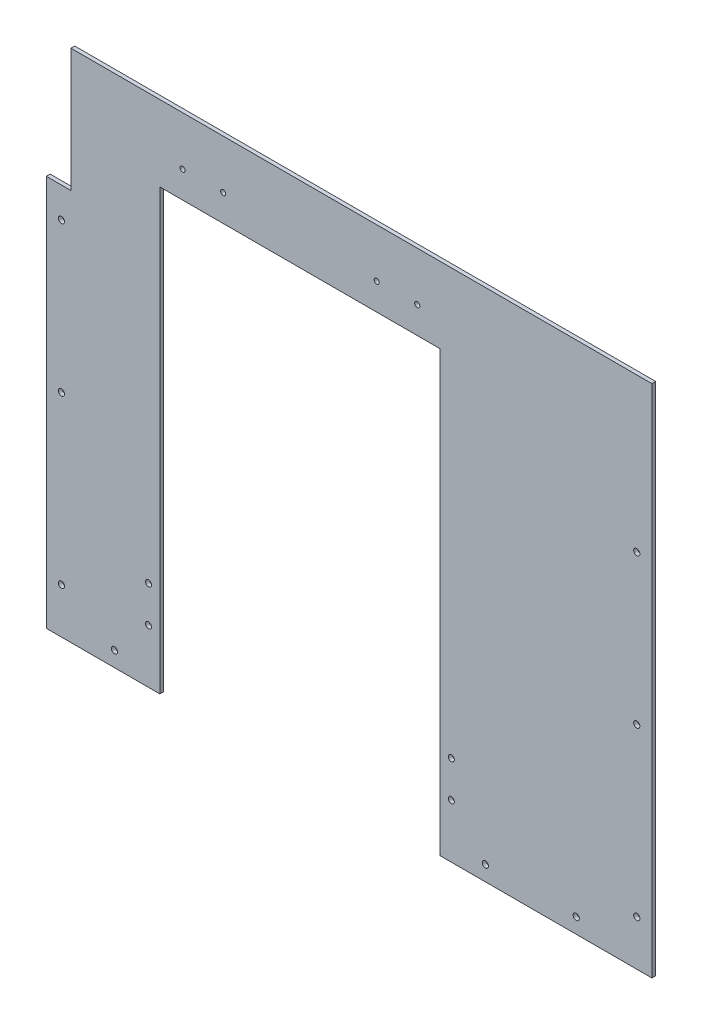
ISO-10303-21;
HEADER;
FILE_DESCRIPTION(('STEP AP214'),'2;1');
FILE_NAME('part.step','',(''),(''),'','','');
FILE_SCHEMA(('AUTOMOTIVE_DESIGN { 1 0 10303 214 1 1 1 1 }'));
ENDSEC;
DATA;
#1=APPLICATION_CONTEXT('core data for automotive mechanical design processes');
#2=APPLICATION_PROTOCOL_DEFINITION('international standard','automotive_design',2000,#1);
#3=PRODUCT_CONTEXT('',#1,'mechanical');
#4=PRODUCT('Part','Part','',(#3));
#5=PRODUCT_RELATED_PRODUCT_CATEGORY('part','',(#4));
#6=PRODUCT_DEFINITION_FORMATION('','',#4);
#7=PRODUCT_DEFINITION_CONTEXT('part definition',#1,'design');
#8=PRODUCT_DEFINITION('design','',#6,#7);
#9=PRODUCT_DEFINITION_SHAPE('','',#8);
#10=(LENGTH_UNIT() NAMED_UNIT(*) SI_UNIT(.MILLI.,.METRE.));
#11=(NAMED_UNIT(*) PLANE_ANGLE_UNIT() SI_UNIT($,.RADIAN.));
#12=(NAMED_UNIT(*) SI_UNIT($,.STERADIAN.) SOLID_ANGLE_UNIT());
#13=UNCERTAINTY_MEASURE_WITH_UNIT(LENGTH_MEASURE(1.E-05),#10,'distance_accuracy_value','');
#14=(GEOMETRIC_REPRESENTATION_CONTEXT(3) GLOBAL_UNCERTAINTY_ASSIGNED_CONTEXT((#13)) GLOBAL_UNIT_ASSIGNED_CONTEXT((#10,
#11,#12)) REPRESENTATION_CONTEXT('',''));
#15=CARTESIAN_POINT('',(0.,0.,0.));
#16=DIRECTION('',(0.,0.,1.));
#17=DIRECTION('',(1.,0.,0.));
#18=AXIS2_PLACEMENT_3D('',#15,#16,#17);
#19=CARTESIAN_POINT('',(0.,0.,3.175));
#20=DIRECTION('',(0.,1.,0.));
#21=DIRECTION('',(0.,0.,1.));
#22=AXIS2_PLACEMENT_3D('',#19,#20,#21);
#23=PLANE('',#22);
#24=DIRECTION('',(1.,0.,0.));
#25=VECTOR('',#24,1.);
#26=CARTESIAN_POINT('',(0.,0.,0.));
#27=LINE('',#26,#25);
#28=CARTESIAN_POINT('',(0.,0.,0.));
#29=VERTEX_POINT('',#28);
#30=CARTESIAN_POINT('',(95.2500000000001,-1.02649894704531E-13,0.));
#31=VERTEX_POINT('',#30);
#32=EDGE_CURVE('E147',#29,#31,#27,.T.);
#33=ORIENTED_EDGE('',*,*,#32,.T.);
#34=DIRECTION('',(0.,0.,-1.));
#35=VECTOR('',#34,1.);
#36=CARTESIAN_POINT('',(95.2500000000001,-1.02649894704531E-13,44.45));
#37=LINE('',#36,#35);
#38=CARTESIAN_POINT('',(95.2500000000001,-1.02649894704531E-13,3.175));
#39=VERTEX_POINT('',#38);
#40=EDGE_CURVE('E234',#39,#31,#37,.T.);
#41=ORIENTED_EDGE('',*,*,#40,.F.);
#42=DIRECTION('',(1.,0.,0.));
#43=VECTOR('',#42,1.);
#44=CARTESIAN_POINT('',(0.,0.,3.175));
#45=LINE('',#44,#43);
#46=CARTESIAN_POINT('',(0.,0.,3.175));
#47=VERTEX_POINT('',#46);
#48=EDGE_CURVE('E160',#47,#39,#45,.T.);
#49=ORIENTED_EDGE('',*,*,#48,.F.);
#50=DIRECTION('',(0.,0.,-1.));
#51=VECTOR('',#50,1.);
#52=CARTESIAN_POINT('',(0.,0.,3.175));
#53=LINE('',#52,#51);
#54=EDGE_CURVE('E11',#47,#29,#53,.T.);
#55=ORIENTED_EDGE('',*,*,#54,.T.);
#56=EDGE_LOOP('',(#33,#41,#49,#55));
#57=FACE_BOUND('',#56,.T.);
#58=ADVANCED_FACE('F42',(#57),#23,.F.);
#59=CARTESIAN_POINT('',(0.,0.,3.175));
#60=DIRECTION('',(1.,0.,0.));
#61=DIRECTION('',(0.,0.,-1.));
#62=AXIS2_PLACEMENT_3D('',#59,#60,#61);
#63=PLANE('',#62);
#64=DIRECTION('',(0.,-1.,0.));
#65=VECTOR('',#64,1.);
#66=CARTESIAN_POINT('',(0.,0.,3.175));
#67=LINE('',#66,#65);
#68=CARTESIAN_POINT('',(0.,328.45375,3.175));
#69=VERTEX_POINT('',#68);
#70=EDGE_CURVE('E146',#69,#47,#67,.T.);
#71=ORIENTED_EDGE('',*,*,#70,.F.);
#72=DIRECTION('',(0.,0.,-1.));
#73=VECTOR('',#72,1.);
#74=CARTESIAN_POINT('',(0.,328.45375,44.45));
#75=LINE('',#74,#73);
#76=CARTESIAN_POINT('',(0.,328.45375,0.));
#77=VERTEX_POINT('',#76);
#78=EDGE_CURVE('E219',#69,#77,#75,.T.);
#79=ORIENTED_EDGE('',*,*,#78,.T.);
#80=DIRECTION('',(0.,-1.,0.));
#81=VECTOR('',#80,1.);
#82=CARTESIAN_POINT('',(0.,0.,0.));
#83=LINE('',#82,#81);
#84=EDGE_CURVE('E166',#77,#29,#83,.T.);
#85=ORIENTED_EDGE('',*,*,#84,.T.);
#86=ORIENTED_EDGE('',*,*,#54,.F.);
#87=EDGE_LOOP('',(#71,#79,#85,#86));
#88=FACE_BOUND('',#87,.T.);
#89=ADVANCED_FACE('F44',(#88),#63,.F.);
#90=CARTESIAN_POINT('',(330.2,-1.60196047796465E-13,3.175));
#91=VERTEX_POINT('',#90);
#92=CARTESIAN_POINT('',(508.,0.,3.175));
#93=VERTEX_POINT('',#92);
#94=EDGE_CURVE('E151',#91,#93,#45,.T.);
#95=ORIENTED_EDGE('',*,*,#94,.F.);
#96=DIRECTION('',(0.,0.,-1.));
#97=VECTOR('',#96,1.);
#98=CARTESIAN_POINT('',(330.2,-1.60196047796465E-13,44.45));
#99=LINE('',#98,#97);
#100=CARTESIAN_POINT('',(330.2,-1.60196047796465E-13,0.));
#101=VERTEX_POINT('',#100);
#102=EDGE_CURVE('E230',#91,#101,#99,.T.);
#103=ORIENTED_EDGE('',*,*,#102,.T.);
#104=CARTESIAN_POINT('',(508.,0.,0.));
#105=VERTEX_POINT('',#104);
#106=EDGE_CURVE('E154',#101,#105,#27,.T.);
#107=ORIENTED_EDGE('',*,*,#106,.T.);
#108=DIRECTION('',(0.,0.,-1.));
#109=VECTOR('',#108,1.);
#110=CARTESIAN_POINT('',(508.,0.,3.175));
#111=LINE('',#110,#109);
#112=EDGE_CURVE('E51',#93,#105,#111,.T.);
#113=ORIENTED_EDGE('',*,*,#112,.F.);
#114=EDGE_LOOP('',(#95,#103,#107,#113));
#115=FACE_BOUND('',#114,.T.);
#116=ADVANCED_FACE('F381',(#115),#23,.F.);
#117=CARTESIAN_POINT('',(508.,0.,3.175));
#118=DIRECTION('',(-1.,0.,0.));
#119=DIRECTION('',(0.,0.,1.));
#120=AXIS2_PLACEMENT_3D('',#117,#118,#119);
#121=PLANE('',#120);
#122=DIRECTION('',(0.,1.,0.));
#123=VECTOR('',#122,1.);
#124=CARTESIAN_POINT('',(508.,0.,0.));
#125=LINE('',#124,#123);
#126=CARTESIAN_POINT('',(508.,431.8,0.));
#127=VERTEX_POINT('',#126);
#128=EDGE_CURVE('E137',#105,#127,#125,.T.);
#129=ORIENTED_EDGE('',*,*,#128,.T.);
#130=DIRECTION('',(0.,0.,1.));
#131=VECTOR('',#130,1.);
#132=CARTESIAN_POINT('',(508.,431.8,0.));
#133=LINE('',#132,#131);
#134=CARTESIAN_POINT('',(508.,431.8,3.175));
#135=VERTEX_POINT('',#134);
#136=EDGE_CURVE('E119',#127,#135,#133,.T.);
#137=ORIENTED_EDGE('',*,*,#136,.T.);
#138=DIRECTION('',(0.,1.,0.));
#139=VECTOR('',#138,1.);
#140=CARTESIAN_POINT('',(508.,0.,3.175));
#141=LINE('',#140,#139);
#142=EDGE_CURVE('E158',#93,#135,#141,.T.);
#143=ORIENTED_EDGE('',*,*,#142,.F.);
#144=ORIENTED_EDGE('',*,*,#112,.T.);
#145=EDGE_LOOP('',(#129,#137,#143,#144));
#146=FACE_BOUND('',#145,.T.);
#147=ADVANCED_FACE('F143',(#146),#121,.F.);
#148=CARTESIAN_POINT('',(0.,0.,3.175));
#149=DIRECTION('',(0.,0.,-1.));
#150=DIRECTION('',(-1.,0.,0.));
#151=AXIS2_PLACEMENT_3D('',#148,#149,#150);
#152=PLANE('',#151);
#153=CARTESIAN_POINT('',(368.3,12.7,3.175));
#154=DIRECTION('',(0.,0.,1.));
#155=DIRECTION('',(1.,0.,0.));
#156=AXIS2_PLACEMENT_3D('',#153,#154,#155);
#157=CIRCLE('',#156,2.60000000000002);
#158=CARTESIAN_POINT('',(370.9,12.7,3.175));
#159=VERTEX_POINT('',#158);
#160=EDGE_CURVE('E337',#159,#159,#157,.T.);
#161=ORIENTED_EDGE('',*,*,#160,.F.);
#162=EDGE_LOOP('',(#161));
#163=FACE_BOUND('',#162,.T.);
#164=CARTESIAN_POINT('',(57.15,12.6999999999999,3.175));
#165=DIRECTION('',(0.,0.,1.));
#166=DIRECTION('',(1.,0.,0.));
#167=AXIS2_PLACEMENT_3D('',#164,#165,#166);
#168=CIRCLE('',#167,2.6);
#169=CARTESIAN_POINT('',(59.75,12.6999999999999,3.175));
#170=VERTEX_POINT('',#169);
#171=EDGE_CURVE('E346',#170,#170,#168,.T.);
#172=ORIENTED_EDGE('',*,*,#171,.F.);
#173=EDGE_LOOP('',(#172));
#174=FACE_BOUND('',#173,.T.);
#175=CARTESIAN_POINT('',(495.3,303.05375,3.175));
#176=DIRECTION('',(0.,0.,1.));
#177=DIRECTION('',(1.,0.,0.));
#178=AXIS2_PLACEMENT_3D('',#175,#176,#177);
#179=CIRCLE('',#178,2.60000000000001);
#180=CARTESIAN_POINT('',(497.9,303.05375,3.175));
#181=VERTEX_POINT('',#180);
#182=EDGE_CURVE('E306',#181,#181,#179,.T.);
#183=ORIENTED_EDGE('',*,*,#182,.F.);
#184=EDGE_LOOP('',(#183));
#185=FACE_BOUND('',#184,.T.);
#186=CARTESIAN_POINT('',(495.3,177.8,3.175));
#187=DIRECTION('',(0.,0.,1.));
#188=DIRECTION('',(1.,0.,0.));
#189=AXIS2_PLACEMENT_3D('',#186,#187,#188);
#190=CIRCLE('',#189,2.60000000000001);
#191=CARTESIAN_POINT('',(497.9,177.8,3.175));
#192=VERTEX_POINT('',#191);
#193=EDGE_CURVE('E305',#192,#192,#190,.T.);
#194=ORIENTED_EDGE('',*,*,#193,.F.);
#195=EDGE_LOOP('',(#194));
#196=FACE_BOUND('',#195,.T.);
#197=CARTESIAN_POINT('',(495.3,38.0999999999999,3.175));
#198=DIRECTION('',(0.,0.,1.));
#199=DIRECTION('',(1.,0.,0.));
#200=AXIS2_PLACEMENT_3D('',#197,#198,#199);
#201=CIRCLE('',#200,2.60000000000002);
#202=CARTESIAN_POINT('',(497.9,38.0999999999999,3.175));
#203=VERTEX_POINT('',#202);
#204=EDGE_CURVE('E314',#203,#203,#201,.T.);
#205=ORIENTED_EDGE('',*,*,#204,.F.);
#206=EDGE_LOOP('',(#205));
#207=FACE_BOUND('',#206,.T.);
#208=CARTESIAN_POINT('',(12.7,38.1,3.175));
#209=DIRECTION('',(0.,0.,1.));
#210=DIRECTION('',(1.,0.,0.));
#211=AXIS2_PLACEMENT_3D('',#208,#209,#210);
#212=CIRCLE('',#211,2.59999999999999);
#213=CARTESIAN_POINT('',(15.3,38.1,3.175));
#214=VERTEX_POINT('',#213);
#215=EDGE_CURVE('E322',#214,#214,#212,.T.);
#216=ORIENTED_EDGE('',*,*,#215,.F.);
#217=EDGE_LOOP('',(#216));
#218=FACE_BOUND('',#217,.T.);
#219=CARTESIAN_POINT('',(12.7,177.8,3.175));
#220=DIRECTION('',(0.,0.,1.));
#221=DIRECTION('',(1.,0.,0.));
#222=AXIS2_PLACEMENT_3D('',#219,#220,#221);
#223=CIRCLE('',#222,2.59999999999999);
#224=CARTESIAN_POINT('',(15.3,177.8,3.175));
#225=VERTEX_POINT('',#224);
#226=EDGE_CURVE('E297',#225,#225,#223,.T.);
#227=ORIENTED_EDGE('',*,*,#226,.F.);
#228=EDGE_LOOP('',(#227));
#229=FACE_BOUND('',#228,.T.);
#230=CARTESIAN_POINT('',(444.5,12.7,3.175));
#231=DIRECTION('',(0.,0.,1.));
#232=DIRECTION('',(1.,0.,0.));
#233=AXIS2_PLACEMENT_3D('',#230,#231,#232);
#234=CIRCLE('',#233,2.60000000000002);
#235=CARTESIAN_POINT('',(447.1,12.7,3.175));
#236=VERTEX_POINT('',#235);
#237=EDGE_CURVE('E338',#236,#236,#234,.T.);
#238=ORIENTED_EDGE('',*,*,#237,.F.);
#239=EDGE_LOOP('',(#238));
#240=FACE_BOUND('',#239,.T.);
#241=CARTESIAN_POINT('',(12.7,303.05375,3.175));
#242=DIRECTION('',(0.,0.,1.));
#243=DIRECTION('',(1.,0.,0.));
#244=AXIS2_PLACEMENT_3D('',#241,#242,#243);
#245=CIRCLE('',#244,2.6);
#246=CARTESIAN_POINT('',(15.2999999999999,303.05375,3.175));
#247=VERTEX_POINT('',#246);
#248=EDGE_CURVE('E293',#247,#247,#245,.T.);
#249=ORIENTED_EDGE('',*,*,#248,.F.);
#250=EDGE_LOOP('',(#249));
#251=FACE_BOUND('',#250,.T.);
#252=CARTESIAN_POINT('',(311.1754,390.779,3.175));
#253=DIRECTION('',(0.,0.,-1.));
#254=DIRECTION('',(-1.,0.,0.));
#255=AXIS2_PLACEMENT_3D('',#252,#253,#254);
#256=CIRCLE('',#255,2.15900000000003);
#257=CARTESIAN_POINT('',(309.0164,390.779,3.175));
#258=VERTEX_POINT('',#257);
#259=EDGE_CURVE('E260',#258,#258,#256,.T.);
#260=ORIENTED_EDGE('',*,*,#259,.T.);
#261=EDGE_LOOP('',(#260));
#262=FACE_BOUND('',#261,.T.);
#263=CARTESIAN_POINT('',(277.1394,390.779,3.175));
#264=DIRECTION('',(0.,0.,-1.));
#265=DIRECTION('',(-1.,0.,0.));
#266=AXIS2_PLACEMENT_3D('',#263,#264,#265);
#267=CIRCLE('',#266,2.15900000000003);
#268=CARTESIAN_POINT('',(274.9804,390.779,3.175));
#269=VERTEX_POINT('',#268);
#270=EDGE_CURVE('E278',#269,#269,#267,.T.);
#271=ORIENTED_EDGE('',*,*,#270,.T.);
#272=EDGE_LOOP('',(#271));
#273=FACE_BOUND('',#272,.T.);
#274=CARTESIAN_POINT('',(148.3614,390.779,3.175));
#275=DIRECTION('',(0.,0.,-1.));
#276=DIRECTION('',(-1.,0.,0.));
#277=AXIS2_PLACEMENT_3D('',#274,#275,#276);
#278=CIRCLE('',#277,2.159);
#279=CARTESIAN_POINT('',(146.2024,390.779,3.175));
#280=VERTEX_POINT('',#279);
#281=EDGE_CURVE('E270',#280,#280,#278,.T.);
#282=ORIENTED_EDGE('',*,*,#281,.T.);
#283=EDGE_LOOP('',(#282));
#284=FACE_BOUND('',#283,.T.);
#285=CARTESIAN_POINT('',(114.3254,390.779,3.175));
#286=DIRECTION('',(0.,0.,-1.));
#287=DIRECTION('',(-1.,0.,0.));
#288=AXIS2_PLACEMENT_3D('',#285,#286,#287);
#289=CIRCLE('',#288,2.159);
#290=CARTESIAN_POINT('',(112.1664,390.779,3.175));
#291=VERTEX_POINT('',#290);
#292=EDGE_CURVE('E261',#291,#291,#289,.T.);
#293=ORIENTED_EDGE('',*,*,#292,.T.);
#294=EDGE_LOOP('',(#293));
#295=FACE_BOUND('',#294,.T.);
#296=ORIENTED_EDGE('',*,*,#142,.T.);
#297=DIRECTION('',(1.,0.,0.));
#298=VECTOR('',#297,1.);
#299=CARTESIAN_POINT('',(20.6374999999999,431.8,3.175));
#300=LINE('',#299,#298);
#301=CARTESIAN_POINT('',(20.6374999999999,431.8,3.175));
#302=VERTEX_POINT('',#301);
#303=EDGE_CURVE('E122',#302,#135,#300,.T.);
#304=ORIENTED_EDGE('',*,*,#303,.F.);
#305=DIRECTION('',(0.,-1.,0.));
#306=VECTOR('',#305,1.);
#307=CARTESIAN_POINT('',(20.6375,0.,3.175));
#308=LINE('',#307,#306);
#309=CARTESIAN_POINT('',(20.6374999999999,328.45375,3.175));
#310=VERTEX_POINT('',#309);
#311=EDGE_CURVE('E191',#302,#310,#308,.T.);
#312=ORIENTED_EDGE('',*,*,#311,.T.);
#313=DIRECTION('',(-1.,0.,0.));
#314=VECTOR('',#313,1.);
#315=CARTESIAN_POINT('',(0.,328.45375,3.175));
#316=LINE('',#315,#314);
#317=EDGE_CURVE('E187',#310,#69,#316,.T.);
#318=ORIENTED_EDGE('',*,*,#317,.T.);
#319=ORIENTED_EDGE('',*,*,#70,.T.);
#320=ORIENTED_EDGE('',*,*,#48,.T.);
#321=DIRECTION('',(0.,1.,0.));
#322=VECTOR('',#321,1.);
#323=CARTESIAN_POINT('',(95.2500000000001,0.,3.175));
#324=LINE('',#323,#322);
#325=CARTESIAN_POINT('',(95.2500000000001,368.3,3.175));
#326=VERTEX_POINT('',#325);
#327=EDGE_CURVE('E168',#39,#326,#324,.T.);
#328=ORIENTED_EDGE('',*,*,#327,.T.);
#329=DIRECTION('',(1.,0.,0.));
#330=VECTOR('',#329,1.);
#331=CARTESIAN_POINT('',(0.,368.3,3.175));
#332=LINE('',#331,#330);
#333=CARTESIAN_POINT('',(330.2,368.3,3.175));
#334=VERTEX_POINT('',#333);
#335=EDGE_CURVE('E182',#326,#334,#332,.T.);
#336=ORIENTED_EDGE('',*,*,#335,.T.);
#337=DIRECTION('',(0.,-1.,0.));
#338=VECTOR('',#337,1.);
#339=CARTESIAN_POINT('',(330.2,0.,3.175));
#340=LINE('',#339,#338);
#341=EDGE_CURVE('E177',#334,#91,#340,.T.);
#342=ORIENTED_EDGE('',*,*,#341,.T.);
#343=ORIENTED_EDGE('',*,*,#94,.T.);
#344=EDGE_LOOP('',(#296,#304,#312,#318,#319,#320,#328,#336,#342,#343));
#345=FACE_BOUND('',#344,.T.);
#346=CARTESIAN_POINT('',(339.725,75.565,3.175));
#347=DIRECTION('',(0.,0.,-1.));
#348=DIRECTION('',(-1.,0.,0.));
#349=AXIS2_PLACEMENT_3D('',#346,#347,#348);
#350=CIRCLE('',#349,2.54000000000001);
#351=CARTESIAN_POINT('',(337.185,75.565,3.175));
#352=VERTEX_POINT('',#351);
#353=EDGE_CURVE('E194',#352,#352,#350,.T.);
#354=ORIENTED_EDGE('',*,*,#353,.T.);
#355=EDGE_LOOP('',(#354));
#356=FACE_BOUND('',#355,.T.);
#357=CARTESIAN_POINT('',(85.7250000000001,45.085,3.175));
#358=DIRECTION('',(0.,0.,-1.));
#359=DIRECTION('',(-1.,0.,0.));
#360=AXIS2_PLACEMENT_3D('',#357,#358,#359);
#361=CIRCLE('',#360,2.53999999999998);
#362=CARTESIAN_POINT('',(83.1850000000001,45.085,3.175));
#363=VERTEX_POINT('',#362);
#364=EDGE_CURVE('E198',#363,#363,#361,.T.);
#365=ORIENTED_EDGE('',*,*,#364,.T.);
#366=EDGE_LOOP('',(#365));
#367=FACE_BOUND('',#366,.T.);
#368=CARTESIAN_POINT('',(85.725,75.565,3.175));
#369=DIRECTION('',(0.,0.,-1.));
#370=DIRECTION('',(-1.,0.,0.));
#371=AXIS2_PLACEMENT_3D('',#368,#369,#370);
#372=CIRCLE('',#371,2.54000000000001);
#373=CARTESIAN_POINT('',(83.185,75.565,3.175));
#374=VERTEX_POINT('',#373);
#375=EDGE_CURVE('E202',#374,#374,#372,.T.);
#376=ORIENTED_EDGE('',*,*,#375,.T.);
#377=EDGE_LOOP('',(#376));
#378=FACE_BOUND('',#377,.T.);
#379=CARTESIAN_POINT('',(339.725,45.085,3.175));
#380=DIRECTION('',(0.,0.,-1.));
#381=DIRECTION('',(-1.,0.,0.));
#382=AXIS2_PLACEMENT_3D('',#379,#380,#381);
#383=CIRCLE('',#382,2.54000000000001);
#384=CARTESIAN_POINT('',(337.185,45.085,3.175));
#385=VERTEX_POINT('',#384);
#386=EDGE_CURVE('E206',#385,#385,#383,.T.);
#387=ORIENTED_EDGE('',*,*,#386,.T.);
#388=EDGE_LOOP('',(#387));
#389=FACE_BOUND('',#388,.T.);
#390=ADVANCED_FACE('F368',(#163,#174,#185,#196,#207,#218,#229,#240,#251,#262,#273,#284,#295,
#345,#356,#367,#378,#389),#152,.F.);
#391=CARTESIAN_POINT('',(0.,0.,0.));
#392=DIRECTION('',(0.,0.,-1.));
#393=DIRECTION('',(-1.,0.,0.));
#394=AXIS2_PLACEMENT_3D('',#391,#392,#393);
#395=PLANE('',#394);
#396=DIRECTION('',(1.,0.,0.));
#397=VECTOR('',#396,1.);
#398=CARTESIAN_POINT('',(20.6374999999999,431.8,0.));
#399=LINE('',#398,#397);
#400=CARTESIAN_POINT('',(20.6374999999999,431.8,0.));
#401=VERTEX_POINT('',#400);
#402=EDGE_CURVE('E58',#401,#127,#399,.T.);
#403=ORIENTED_EDGE('',*,*,#402,.T.);
#404=ORIENTED_EDGE('',*,*,#128,.F.);
#405=ORIENTED_EDGE('',*,*,#106,.F.);
#406=DIRECTION('',(0.,-1.,0.));
#407=VECTOR('',#406,1.);
#408=CARTESIAN_POINT('',(330.2,-1.60196047796465E-13,0.));
#409=LINE('',#408,#407);
#410=CARTESIAN_POINT('',(330.2,368.3,0.));
#411=VERTEX_POINT('',#410);
#412=EDGE_CURVE('E227',#411,#101,#409,.T.);
#413=ORIENTED_EDGE('',*,*,#412,.F.);
#414=DIRECTION('',(1.,0.,0.));
#415=VECTOR('',#414,1.);
#416=CARTESIAN_POINT('',(95.2500000000001,368.3,0.));
#417=LINE('',#416,#415);
#418=CARTESIAN_POINT('',(95.2500000000001,368.3,0.));
#419=VERTEX_POINT('',#418);
#420=EDGE_CURVE('E239',#419,#411,#417,.T.);
#421=ORIENTED_EDGE('',*,*,#420,.F.);
#422=DIRECTION('',(0.,1.,0.));
#423=VECTOR('',#422,1.);
#424=CARTESIAN_POINT('',(95.2500000000001,-1.02649894704531E-13,0.));
#425=LINE('',#424,#423);
#426=EDGE_CURVE('E66',#31,#419,#425,.T.);
#427=ORIENTED_EDGE('',*,*,#426,.F.);
#428=ORIENTED_EDGE('',*,*,#32,.F.);
#429=ORIENTED_EDGE('',*,*,#84,.F.);
#430=DIRECTION('',(-1.,0.,0.));
#431=VECTOR('',#430,1.);
#432=CARTESIAN_POINT('',(0.,328.45375,0.));
#433=LINE('',#432,#431);
#434=CARTESIAN_POINT('',(20.6374999999999,328.45375,0.));
#435=VERTEX_POINT('',#434);
#436=EDGE_CURVE('E250',#435,#77,#433,.T.);
#437=ORIENTED_EDGE('',*,*,#436,.F.);
#438=DIRECTION('',(0.,-1.,0.));
#439=VECTOR('',#438,1.);
#440=CARTESIAN_POINT('',(20.6374999999999,403.06625,0.));
#441=LINE('',#440,#439);
#442=EDGE_CURVE('E139',#401,#435,#441,.T.);
#443=ORIENTED_EDGE('',*,*,#442,.F.);
#444=EDGE_LOOP('',(#403,#404,#405,#413,#421,#427,#428,#429,#437,#443));
#445=FACE_BOUND('',#444,.T.);
#446=CARTESIAN_POINT('',(368.3,12.7,0.));
#447=DIRECTION('',(0.,0.,1.));
#448=DIRECTION('',(1.,0.,0.));
#449=AXIS2_PLACEMENT_3D('',#446,#447,#448);
#450=CIRCLE('',#449,2.60000000000002);
#451=CARTESIAN_POINT('',(370.9,12.7,0.));
#452=VERTEX_POINT('',#451);
#453=EDGE_CURVE('E333',#452,#452,#450,.T.);
#454=ORIENTED_EDGE('',*,*,#453,.T.);
#455=EDGE_LOOP('',(#454));
#456=FACE_BOUND('',#455,.T.);
#457=CARTESIAN_POINT('',(57.15,12.6999999999999,0.));
#458=DIRECTION('',(0.,0.,1.));
#459=DIRECTION('',(1.,0.,0.));
#460=AXIS2_PLACEMENT_3D('',#457,#458,#459);
#461=CIRCLE('',#460,2.6);
#462=CARTESIAN_POINT('',(59.75,12.6999999999999,0.));
#463=VERTEX_POINT('',#462);
#464=EDGE_CURVE('E342',#463,#463,#461,.T.);
#465=ORIENTED_EDGE('',*,*,#464,.T.);
#466=EDGE_LOOP('',(#465));
#467=FACE_BOUND('',#466,.T.);
#468=CARTESIAN_POINT('',(495.3,303.05375,0.));
#469=DIRECTION('',(0.,0.,1.));
#470=DIRECTION('',(1.,0.,0.));
#471=AXIS2_PLACEMENT_3D('',#468,#469,#470);
#472=CIRCLE('',#471,2.60000000000001);
#473=CARTESIAN_POINT('',(497.9,303.05375,0.));
#474=VERTEX_POINT('',#473);
#475=EDGE_CURVE('E350',#474,#474,#472,.T.);
#476=ORIENTED_EDGE('',*,*,#475,.T.);
#477=EDGE_LOOP('',(#476));
#478=FACE_BOUND('',#477,.T.);
#479=CARTESIAN_POINT('',(495.3,177.8,0.));
#480=DIRECTION('',(0.,0.,1.));
#481=DIRECTION('',(1.,0.,0.));
#482=AXIS2_PLACEMENT_3D('',#479,#480,#481);
#483=CIRCLE('',#482,2.60000000000001);
#484=CARTESIAN_POINT('',(497.9,177.8,0.));
#485=VERTEX_POINT('',#484);
#486=EDGE_CURVE('E301',#485,#485,#483,.T.);
#487=ORIENTED_EDGE('',*,*,#486,.T.);
#488=EDGE_LOOP('',(#487));
#489=FACE_BOUND('',#488,.T.);
#490=CARTESIAN_POINT('',(495.3,38.0999999999999,0.));
#491=DIRECTION('',(0.,0.,1.));
#492=DIRECTION('',(1.,0.,0.));
#493=AXIS2_PLACEMENT_3D('',#490,#491,#492);
#494=CIRCLE('',#493,2.60000000000002);
#495=CARTESIAN_POINT('',(497.9,38.0999999999999,0.));
#496=VERTEX_POINT('',#495);
#497=EDGE_CURVE('E310',#496,#496,#494,.T.);
#498=ORIENTED_EDGE('',*,*,#497,.T.);
#499=EDGE_LOOP('',(#498));
#500=FACE_BOUND('',#499,.T.);
#501=CARTESIAN_POINT('',(12.7,38.1,0.));
#502=DIRECTION('',(0.,0.,1.));
#503=DIRECTION('',(1.,0.,0.));
#504=AXIS2_PLACEMENT_3D('',#501,#502,#503);
#505=CIRCLE('',#504,2.59999999999999);
#506=CARTESIAN_POINT('',(15.3,38.1,0.));
#507=VERTEX_POINT('',#506);
#508=EDGE_CURVE('E318',#507,#507,#505,.T.);
#509=ORIENTED_EDGE('',*,*,#508,.T.);
#510=EDGE_LOOP('',(#509));
#511=FACE_BOUND('',#510,.T.);
#512=CARTESIAN_POINT('',(12.7,177.8,0.));
#513=DIRECTION('',(0.,0.,1.));
#514=DIRECTION('',(1.,0.,0.));
#515=AXIS2_PLACEMENT_3D('',#512,#513,#514);
#516=CIRCLE('',#515,2.59999999999999);
#517=CARTESIAN_POINT('',(15.3,177.8,0.));
#518=VERTEX_POINT('',#517);
#519=EDGE_CURVE('E326',#518,#518,#516,.T.);
#520=ORIENTED_EDGE('',*,*,#519,.T.);
#521=EDGE_LOOP('',(#520));
#522=FACE_BOUND('',#521,.T.);
#523=CARTESIAN_POINT('',(444.5,12.7,0.));
#524=DIRECTION('',(0.,0.,1.));
#525=DIRECTION('',(1.,0.,0.));
#526=AXIS2_PLACEMENT_3D('',#523,#524,#525);
#527=CIRCLE('',#526,2.60000000000002);
#528=CARTESIAN_POINT('',(447.1,12.7,0.));
#529=VERTEX_POINT('',#528);
#530=EDGE_CURVE('E128',#529,#529,#527,.T.);
#531=ORIENTED_EDGE('',*,*,#530,.T.);
#532=EDGE_LOOP('',(#531));
#533=FACE_BOUND('',#532,.T.);
#534=CARTESIAN_POINT('',(12.7,303.05375,0.));
#535=DIRECTION('',(0.,0.,1.));
#536=DIRECTION('',(1.,0.,0.));
#537=AXIS2_PLACEMENT_3D('',#534,#535,#536);
#538=CIRCLE('',#537,2.6);
#539=CARTESIAN_POINT('',(15.2999999999999,303.05375,0.));
#540=VERTEX_POINT('',#539);
#541=EDGE_CURVE('E266',#540,#540,#538,.T.);
#542=ORIENTED_EDGE('',*,*,#541,.T.);
#543=EDGE_LOOP('',(#542));
#544=FACE_BOUND('',#543,.T.);
#545=CARTESIAN_POINT('',(311.1754,390.779,0.));
#546=DIRECTION('',(0.,0.,-1.));
#547=DIRECTION('',(-1.,0.,0.));
#548=AXIS2_PLACEMENT_3D('',#545,#546,#547);
#549=CIRCLE('',#548,2.15900000000003);
#550=CARTESIAN_POINT('',(309.0164,390.779,0.));
#551=VERTEX_POINT('',#550);
#552=EDGE_CURVE('E286',#551,#551,#549,.T.);
#553=ORIENTED_EDGE('',*,*,#552,.F.);
#554=EDGE_LOOP('',(#553));
#555=FACE_BOUND('',#554,.T.);
#556=CARTESIAN_POINT('',(277.1394,390.779,0.));
#557=DIRECTION('',(0.,0.,-1.));
#558=DIRECTION('',(-1.,0.,0.));
#559=AXIS2_PLACEMENT_3D('',#556,#557,#558);
#560=CIRCLE('',#559,2.15900000000003);
#561=CARTESIAN_POINT('',(274.9804,390.779,0.));
#562=VERTEX_POINT('',#561);
#563=EDGE_CURVE('E282',#562,#562,#560,.T.);
#564=ORIENTED_EDGE('',*,*,#563,.F.);
#565=EDGE_LOOP('',(#564));
#566=FACE_BOUND('',#565,.T.);
#567=CARTESIAN_POINT('',(148.3614,390.779,0.));
#568=DIRECTION('',(0.,0.,-1.));
#569=DIRECTION('',(-1.,0.,0.));
#570=AXIS2_PLACEMENT_3D('',#567,#568,#569);
#571=CIRCLE('',#570,2.159);
#572=CARTESIAN_POINT('',(146.2024,390.779,0.));
#573=VERTEX_POINT('',#572);
#574=EDGE_CURVE('E274',#573,#573,#571,.T.);
#575=ORIENTED_EDGE('',*,*,#574,.F.);
#576=EDGE_LOOP('',(#575));
#577=FACE_BOUND('',#576,.T.);
#578=CARTESIAN_POINT('',(114.3254,390.779,0.));
#579=DIRECTION('',(0.,0.,-1.));
#580=DIRECTION('',(-1.,0.,0.));
#581=AXIS2_PLACEMENT_3D('',#578,#579,#580);
#582=CIRCLE('',#581,2.159);
#583=CARTESIAN_POINT('',(112.1664,390.779,0.));
#584=VERTEX_POINT('',#583);
#585=EDGE_CURVE('E265',#584,#584,#582,.T.);
#586=ORIENTED_EDGE('',*,*,#585,.F.);
#587=EDGE_LOOP('',(#586));
#588=FACE_BOUND('',#587,.T.);
#589=CARTESIAN_POINT('',(339.725,75.565,0.));
#590=DIRECTION('',(0.,0.,-1.));
#591=DIRECTION('',(-1.,0.,0.));
#592=AXIS2_PLACEMENT_3D('',#589,#590,#591);
#593=CIRCLE('',#592,2.54000000000001);
#594=CARTESIAN_POINT('',(337.185,75.565,0.));
#595=VERTEX_POINT('',#594);
#596=EDGE_CURVE('E215',#595,#595,#593,.T.);
#597=ORIENTED_EDGE('',*,*,#596,.F.);
#598=EDGE_LOOP('',(#597));
#599=FACE_BOUND('',#598,.T.);
#600=CARTESIAN_POINT('',(85.7250000000001,45.085,0.));
#601=DIRECTION('',(0.,0.,-1.));
#602=DIRECTION('',(-1.,0.,0.));
#603=AXIS2_PLACEMENT_3D('',#600,#601,#602);
#604=CIRCLE('',#603,2.53999999999998);
#605=CARTESIAN_POINT('',(83.1850000000001,45.085,0.));
#606=VERTEX_POINT('',#605);
#607=EDGE_CURVE('E214',#606,#606,#604,.T.);
#608=ORIENTED_EDGE('',*,*,#607,.F.);
#609=EDGE_LOOP('',(#608));
#610=FACE_BOUND('',#609,.T.);
#611=CARTESIAN_POINT('',(85.725,75.565,0.));
#612=DIRECTION('',(0.,0.,-1.));
#613=DIRECTION('',(1.,0.,0.));
#614=AXIS2_PLACEMENT_3D('',#611,#612,#613);
#615=CIRCLE('',#614,2.54000000000001);
#616=CARTESIAN_POINT('',(88.265,75.565,0.));
#617=VERTEX_POINT('',#616);
#618=EDGE_CURVE('E245',#617,#617,#615,.T.);
#619=ORIENTED_EDGE('',*,*,#618,.F.);
#620=EDGE_LOOP('',(#619));
#621=FACE_BOUND('',#620,.T.);
#622=CARTESIAN_POINT('',(339.725,45.085,0.));
#623=DIRECTION('',(0.,0.,-1.));
#624=DIRECTION('',(-1.,0.,0.));
#625=AXIS2_PLACEMENT_3D('',#622,#623,#624);
#626=CIRCLE('',#625,2.54000000000001);
#627=CARTESIAN_POINT('',(337.185,45.085,0.));
#628=VERTEX_POINT('',#627);
#629=EDGE_CURVE('E210',#628,#628,#626,.T.);
#630=ORIENTED_EDGE('',*,*,#629,.F.);
#631=EDGE_LOOP('',(#630));
#632=FACE_BOUND('',#631,.T.);
#633=ADVANCED_FACE('F134',(#445,#456,#467,#478,#489,#500,#511,#522,#533,#544,#555,#566,#577,
#588,#599,#610,#621,#632),#395,.T.);
#634=CARTESIAN_POINT('',(339.725,45.085,44.45));
#635=DIRECTION('',(0.,0.,-1.));
#636=DIRECTION('',(-1.,0.,0.));
#637=AXIS2_PLACEMENT_3D('',#634,#635,#636);
#638=CYLINDRICAL_SURFACE('',#637,2.54000000000001);
#639=ORIENTED_EDGE('',*,*,#629,.T.);
#640=EDGE_LOOP('',(#639));
#641=FACE_BOUND('',#640,.T.);
#642=ORIENTED_EDGE('',*,*,#386,.F.);
#643=EDGE_LOOP('',(#642));
#644=FACE_BOUND('',#643,.T.);
#645=ADVANCED_FACE('F394',(#641,#644),#638,.F.);
#646=CARTESIAN_POINT('',(85.725,75.565,44.45));
#647=DIRECTION('',(0.,0.,-1.));
#648=DIRECTION('',(-1.,0.,0.));
#649=AXIS2_PLACEMENT_3D('',#646,#647,#648);
#650=CYLINDRICAL_SURFACE('',#649,2.54000000000001);
#651=ORIENTED_EDGE('',*,*,#618,.T.);
#652=EDGE_LOOP('',(#651));
#653=FACE_BOUND('',#652,.T.);
#654=ORIENTED_EDGE('',*,*,#375,.F.);
#655=EDGE_LOOP('',(#654));
#656=FACE_BOUND('',#655,.T.);
#657=ADVANCED_FACE('F400',(#653,#656),#650,.F.);
#658=CARTESIAN_POINT('',(85.7250000000001,45.085,44.45));
#659=DIRECTION('',(0.,0.,-1.));
#660=DIRECTION('',(-1.,0.,0.));
#661=AXIS2_PLACEMENT_3D('',#658,#659,#660);
#662=CYLINDRICAL_SURFACE('',#661,2.53999999999998);
#663=ORIENTED_EDGE('',*,*,#607,.T.);
#664=EDGE_LOOP('',(#663));
#665=FACE_BOUND('',#664,.T.);
#666=ORIENTED_EDGE('',*,*,#364,.F.);
#667=EDGE_LOOP('',(#666));
#668=FACE_BOUND('',#667,.T.);
#669=ADVANCED_FACE('F405',(#665,#668),#662,.F.);
#670=CARTESIAN_POINT('',(339.725,75.565,44.45));
#671=DIRECTION('',(0.,0.,-1.));
#672=DIRECTION('',(-1.,0.,0.));
#673=AXIS2_PLACEMENT_3D('',#670,#671,#672);
#674=CYLINDRICAL_SURFACE('',#673,2.54000000000001);
#675=ORIENTED_EDGE('',*,*,#596,.T.);
#676=EDGE_LOOP('',(#675));
#677=FACE_BOUND('',#676,.T.);
#678=ORIENTED_EDGE('',*,*,#353,.F.);
#679=EDGE_LOOP('',(#678));
#680=FACE_BOUND('',#679,.T.);
#681=ADVANCED_FACE('F402',(#677,#680),#674,.F.);
#682=CARTESIAN_POINT('',(0.,328.45375,44.45));
#683=DIRECTION('',(0.,-1.,0.));
#684=DIRECTION('',(0.,0.,-1.));
#685=AXIS2_PLACEMENT_3D('',#682,#683,#684);
#686=PLANE('',#685);
#687=DIRECTION('',(0.,0.,-1.));
#688=VECTOR('',#687,1.);
#689=CARTESIAN_POINT('',(20.6374999999999,328.45375,44.45));
#690=LINE('',#689,#688);
#691=EDGE_CURVE('E246',#310,#435,#690,.T.);
#692=ORIENTED_EDGE('',*,*,#691,.T.);
#693=ORIENTED_EDGE('',*,*,#436,.T.);
#694=ORIENTED_EDGE('',*,*,#78,.F.);
#695=ORIENTED_EDGE('',*,*,#317,.F.);
#696=EDGE_LOOP('',(#692,#693,#694,#695));
#697=FACE_BOUND('',#696,.T.);
#698=ADVANCED_FACE('F374',(#697),#686,.F.);
#699=CARTESIAN_POINT('',(20.6374999999999,403.06625,44.45));
#700=DIRECTION('',(1.,0.,0.));
#701=DIRECTION('',(0.,1.,0.));
#702=AXIS2_PLACEMENT_3D('',#699,#700,#701);
#703=PLANE('',#702);
#704=ORIENTED_EDGE('',*,*,#311,.F.);
#705=DIRECTION('',(0.,0.,1.));
#706=VECTOR('',#705,1.);
#707=CARTESIAN_POINT('',(20.6374999999999,431.8,0.));
#708=LINE('',#707,#706);
#709=EDGE_CURVE('E129',#401,#302,#708,.T.);
#710=ORIENTED_EDGE('',*,*,#709,.F.);
#711=ORIENTED_EDGE('',*,*,#442,.T.);
#712=ORIENTED_EDGE('',*,*,#691,.F.);
#713=EDGE_LOOP('',(#704,#710,#711,#712));
#714=FACE_BOUND('',#713,.T.);
#715=ADVANCED_FACE('F372',(#714),#703,.F.);
#716=CARTESIAN_POINT('',(95.2500000000001,-1.02649894704531E-13,44.45));
#717=DIRECTION('',(-1.,0.,0.));
#718=DIRECTION('',(0.,0.,1.));
#719=AXIS2_PLACEMENT_3D('',#716,#717,#718);
#720=PLANE('',#719);
#721=ORIENTED_EDGE('',*,*,#40,.T.);
#722=ORIENTED_EDGE('',*,*,#426,.T.);
#723=DIRECTION('',(0.,0.,-1.));
#724=VECTOR('',#723,1.);
#725=CARTESIAN_POINT('',(95.2500000000001,368.3,44.45));
#726=LINE('',#725,#724);
#727=EDGE_CURVE('E223',#326,#419,#726,.T.);
#728=ORIENTED_EDGE('',*,*,#727,.F.);
#729=ORIENTED_EDGE('',*,*,#327,.F.);
#730=EDGE_LOOP('',(#721,#722,#728,#729));
#731=FACE_BOUND('',#730,.T.);
#732=ADVANCED_FACE('F410',(#731),#720,.F.);
#733=CARTESIAN_POINT('',(330.2,-1.60196047796465E-13,44.45));
#734=DIRECTION('',(1.,0.,0.));
#735=DIRECTION('',(0.,0.,-1.));
#736=AXIS2_PLACEMENT_3D('',#733,#734,#735);
#737=PLANE('',#736);
#738=DIRECTION('',(0.,0.,-1.));
#739=VECTOR('',#738,1.);
#740=CARTESIAN_POINT('',(330.2,368.3,44.45));
#741=LINE('',#740,#739);
#742=EDGE_CURVE('E226',#334,#411,#741,.T.);
#743=ORIENTED_EDGE('',*,*,#742,.T.);
#744=ORIENTED_EDGE('',*,*,#412,.T.);
#745=ORIENTED_EDGE('',*,*,#102,.F.);
#746=ORIENTED_EDGE('',*,*,#341,.F.);
#747=EDGE_LOOP('',(#743,#744,#745,#746));
#748=FACE_BOUND('',#747,.T.);
#749=ADVANCED_FACE('F413',(#748),#737,.F.);
#750=CARTESIAN_POINT('',(95.2500000000001,368.3,44.45));
#751=DIRECTION('',(0.,1.,0.));
#752=DIRECTION('',(0.,0.,1.));
#753=AXIS2_PLACEMENT_3D('',#750,#751,#752);
#754=PLANE('',#753);
#755=ORIENTED_EDGE('',*,*,#727,.T.);
#756=ORIENTED_EDGE('',*,*,#420,.T.);
#757=ORIENTED_EDGE('',*,*,#742,.F.);
#758=ORIENTED_EDGE('',*,*,#335,.F.);
#759=EDGE_LOOP('',(#755,#756,#757,#758));
#760=FACE_BOUND('',#759,.T.);
#761=ADVANCED_FACE('F414',(#760),#754,.F.);
#762=CARTESIAN_POINT('',(114.3254,390.779,3.175));
#763=DIRECTION('',(0.,0.,-1.));
#764=DIRECTION('',(-1.,0.,0.));
#765=AXIS2_PLACEMENT_3D('',#762,#763,#764);
#766=CYLINDRICAL_SURFACE('',#765,2.159);
#767=ORIENTED_EDGE('',*,*,#292,.F.);
#768=EDGE_LOOP('',(#767));
#769=FACE_BOUND('',#768,.T.);
#770=ORIENTED_EDGE('',*,*,#585,.T.);
#771=EDGE_LOOP('',(#770));
#772=FACE_BOUND('',#771,.T.);
#773=ADVANCED_FACE('F417',(#769,#772),#766,.F.);
#774=CARTESIAN_POINT('',(148.3614,390.779,3.175));
#775=DIRECTION('',(0.,0.,-1.));
#776=DIRECTION('',(-1.,0.,0.));
#777=AXIS2_PLACEMENT_3D('',#774,#775,#776);
#778=CYLINDRICAL_SURFACE('',#777,2.159);
#779=ORIENTED_EDGE('',*,*,#281,.F.);
#780=EDGE_LOOP('',(#779));
#781=FACE_BOUND('',#780,.T.);
#782=ORIENTED_EDGE('',*,*,#574,.T.);
#783=EDGE_LOOP('',(#782));
#784=FACE_BOUND('',#783,.T.);
#785=ADVANCED_FACE('F431',(#781,#784),#778,.F.);
#786=CARTESIAN_POINT('',(277.1394,390.779,3.175));
#787=DIRECTION('',(0.,0.,-1.));
#788=DIRECTION('',(-1.,0.,0.));
#789=AXIS2_PLACEMENT_3D('',#786,#787,#788);
#790=CYLINDRICAL_SURFACE('',#789,2.15900000000003);
#791=ORIENTED_EDGE('',*,*,#270,.F.);
#792=EDGE_LOOP('',(#791));
#793=FACE_BOUND('',#792,.T.);
#794=ORIENTED_EDGE('',*,*,#563,.T.);
#795=EDGE_LOOP('',(#794));
#796=FACE_BOUND('',#795,.T.);
#797=ADVANCED_FACE('F435',(#793,#796),#790,.F.);
#798=CARTESIAN_POINT('',(311.1754,390.779,3.175));
#799=DIRECTION('',(0.,0.,-1.));
#800=DIRECTION('',(-1.,0.,0.));
#801=AXIS2_PLACEMENT_3D('',#798,#799,#800);
#802=CYLINDRICAL_SURFACE('',#801,2.15900000000003);
#803=ORIENTED_EDGE('',*,*,#259,.F.);
#804=EDGE_LOOP('',(#803));
#805=FACE_BOUND('',#804,.T.);
#806=ORIENTED_EDGE('',*,*,#552,.T.);
#807=EDGE_LOOP('',(#806));
#808=FACE_BOUND('',#807,.T.);
#809=ADVANCED_FACE('F439',(#805,#808),#802,.F.);
#810=CARTESIAN_POINT('',(12.7,303.05375,0.));
#811=DIRECTION('',(0.,0.,1.));
#812=DIRECTION('',(1.,0.,0.));
#813=AXIS2_PLACEMENT_3D('',#810,#811,#812);
#814=CYLINDRICAL_SURFACE('',#813,2.6);
#815=ORIENTED_EDGE('',*,*,#541,.F.);
#816=EDGE_LOOP('',(#815));
#817=FACE_BOUND('',#816,.T.);
#818=ORIENTED_EDGE('',*,*,#248,.T.);
#819=EDGE_LOOP('',(#818));
#820=FACE_BOUND('',#819,.T.);
#821=ADVANCED_FACE('F443',(#817,#820),#814,.F.);
#822=CARTESIAN_POINT('',(444.5,12.7,0.));
#823=DIRECTION('',(0.,0.,1.));
#824=DIRECTION('',(1.,0.,0.));
#825=AXIS2_PLACEMENT_3D('',#822,#823,#824);
#826=CYLINDRICAL_SURFACE('',#825,2.60000000000002);
#827=ORIENTED_EDGE('',*,*,#530,.F.);
#828=EDGE_LOOP('',(#827));
#829=FACE_BOUND('',#828,.T.);
#830=ORIENTED_EDGE('',*,*,#237,.T.);
#831=EDGE_LOOP('',(#830));
#832=FACE_BOUND('',#831,.T.);
#833=ADVANCED_FACE('F447',(#829,#832),#826,.F.);
#834=CARTESIAN_POINT('',(12.7,177.8,0.));
#835=DIRECTION('',(0.,0.,1.));
#836=DIRECTION('',(1.,0.,0.));
#837=AXIS2_PLACEMENT_3D('',#834,#835,#836);
#838=CYLINDRICAL_SURFACE('',#837,2.59999999999999);
#839=ORIENTED_EDGE('',*,*,#519,.F.);
#840=EDGE_LOOP('',(#839));
#841=FACE_BOUND('',#840,.T.);
#842=ORIENTED_EDGE('',*,*,#226,.T.);
#843=EDGE_LOOP('',(#842));
#844=FACE_BOUND('',#843,.T.);
#845=ADVANCED_FACE('F461',(#841,#844),#838,.F.);
#846=CARTESIAN_POINT('',(12.7,38.1,0.));
#847=DIRECTION('',(0.,0.,1.));
#848=DIRECTION('',(1.,0.,0.));
#849=AXIS2_PLACEMENT_3D('',#846,#847,#848);
#850=CYLINDRICAL_SURFACE('',#849,2.59999999999999);
#851=ORIENTED_EDGE('',*,*,#508,.F.);
#852=EDGE_LOOP('',(#851));
#853=FACE_BOUND('',#852,.T.);
#854=ORIENTED_EDGE('',*,*,#215,.T.);
#855=EDGE_LOOP('',(#854));
#856=FACE_BOUND('',#855,.T.);
#857=ADVANCED_FACE('F457',(#853,#856),#850,.F.);
#858=CARTESIAN_POINT('',(495.3,38.0999999999999,0.));
#859=DIRECTION('',(0.,0.,1.));
#860=DIRECTION('',(1.,0.,0.));
#861=AXIS2_PLACEMENT_3D('',#858,#859,#860);
#862=CYLINDRICAL_SURFACE('',#861,2.60000000000002);
#863=ORIENTED_EDGE('',*,*,#497,.F.);
#864=EDGE_LOOP('',(#863));
#865=FACE_BOUND('',#864,.T.);
#866=ORIENTED_EDGE('',*,*,#204,.T.);
#867=EDGE_LOOP('',(#866));
#868=FACE_BOUND('',#867,.T.);
#869=ADVANCED_FACE('F453',(#865,#868),#862,.F.);
#870=CARTESIAN_POINT('',(495.3,177.8,0.));
#871=DIRECTION('',(0.,0.,1.));
#872=DIRECTION('',(1.,0.,0.));
#873=AXIS2_PLACEMENT_3D('',#870,#871,#872);
#874=CYLINDRICAL_SURFACE('',#873,2.60000000000001);
#875=ORIENTED_EDGE('',*,*,#486,.F.);
#876=EDGE_LOOP('',(#875));
#877=FACE_BOUND('',#876,.T.);
#878=ORIENTED_EDGE('',*,*,#193,.T.);
#879=EDGE_LOOP('',(#878));
#880=FACE_BOUND('',#879,.T.);
#881=ADVANCED_FACE('F449',(#877,#880),#874,.F.);
#882=CARTESIAN_POINT('',(495.3,303.05375,0.));
#883=DIRECTION('',(0.,0.,1.));
#884=DIRECTION('',(1.,0.,0.));
#885=AXIS2_PLACEMENT_3D('',#882,#883,#884);
#886=CYLINDRICAL_SURFACE('',#885,2.60000000000001);
#887=ORIENTED_EDGE('',*,*,#475,.F.);
#888=EDGE_LOOP('',(#887));
#889=FACE_BOUND('',#888,.T.);
#890=ORIENTED_EDGE('',*,*,#182,.T.);
#891=EDGE_LOOP('',(#890));
#892=FACE_BOUND('',#891,.T.);
#893=ADVANCED_FACE('F452',(#889,#892),#886,.F.);
#894=CARTESIAN_POINT('',(57.15,12.6999999999999,0.));
#895=DIRECTION('',(0.,0.,1.));
#896=DIRECTION('',(1.,0.,0.));
#897=AXIS2_PLACEMENT_3D('',#894,#895,#896);
#898=CYLINDRICAL_SURFACE('',#897,2.6);
#899=ORIENTED_EDGE('',*,*,#464,.F.);
#900=EDGE_LOOP('',(#899));
#901=FACE_BOUND('',#900,.T.);
#902=ORIENTED_EDGE('',*,*,#171,.T.);
#903=EDGE_LOOP('',(#902));
#904=FACE_BOUND('',#903,.T.);
#905=ADVANCED_FACE('F469',(#901,#904),#898,.F.);
#906=CARTESIAN_POINT('',(368.3,12.7,0.));
#907=DIRECTION('',(0.,0.,1.));
#908=DIRECTION('',(1.,0.,0.));
#909=AXIS2_PLACEMENT_3D('',#906,#907,#908);
#910=CYLINDRICAL_SURFACE('',#909,2.60000000000002);
#911=ORIENTED_EDGE('',*,*,#453,.F.);
#912=EDGE_LOOP('',(#911));
#913=FACE_BOUND('',#912,.T.);
#914=ORIENTED_EDGE('',*,*,#160,.T.);
#915=EDGE_LOOP('',(#914));
#916=FACE_BOUND('',#915,.T.);
#917=ADVANCED_FACE('F466',(#913,#916),#910,.F.);
#918=CARTESIAN_POINT('',(20.6374999999999,431.8,0.));
#919=DIRECTION('',(0.,-1.,0.));
#920=DIRECTION('',(0.,0.,-1.));
#921=AXIS2_PLACEMENT_3D('',#918,#919,#920);
#922=PLANE('',#921);
#923=ORIENTED_EDGE('',*,*,#303,.T.);
#924=ORIENTED_EDGE('',*,*,#136,.F.);
#925=ORIENTED_EDGE('',*,*,#402,.F.);
#926=ORIENTED_EDGE('',*,*,#709,.T.);
#927=EDGE_LOOP('',(#923,#924,#925,#926));
#928=FACE_BOUND('',#927,.T.);
#929=ADVANCED_FACE('F120',(#928),#922,.F.);
#930=CLOSED_SHELL('',(#58,#89,#116,#147,#390,#633,#645,#657,#669,#681,#698,#715,#732,#749,#761,
#773,#785,#797,#809,#821,#833,#845,#857,#869,#881,#893,#905,#917,#929));
#931=MANIFOLD_SOLID_BREP('B2',#930);
#932=ADVANCED_BREP_SHAPE_REPRESENTATION('',(#18,#931),#14);
#933=SHAPE_DEFINITION_REPRESENTATION(#9,#932);
ENDSEC;
END-ISO-10303-21;
